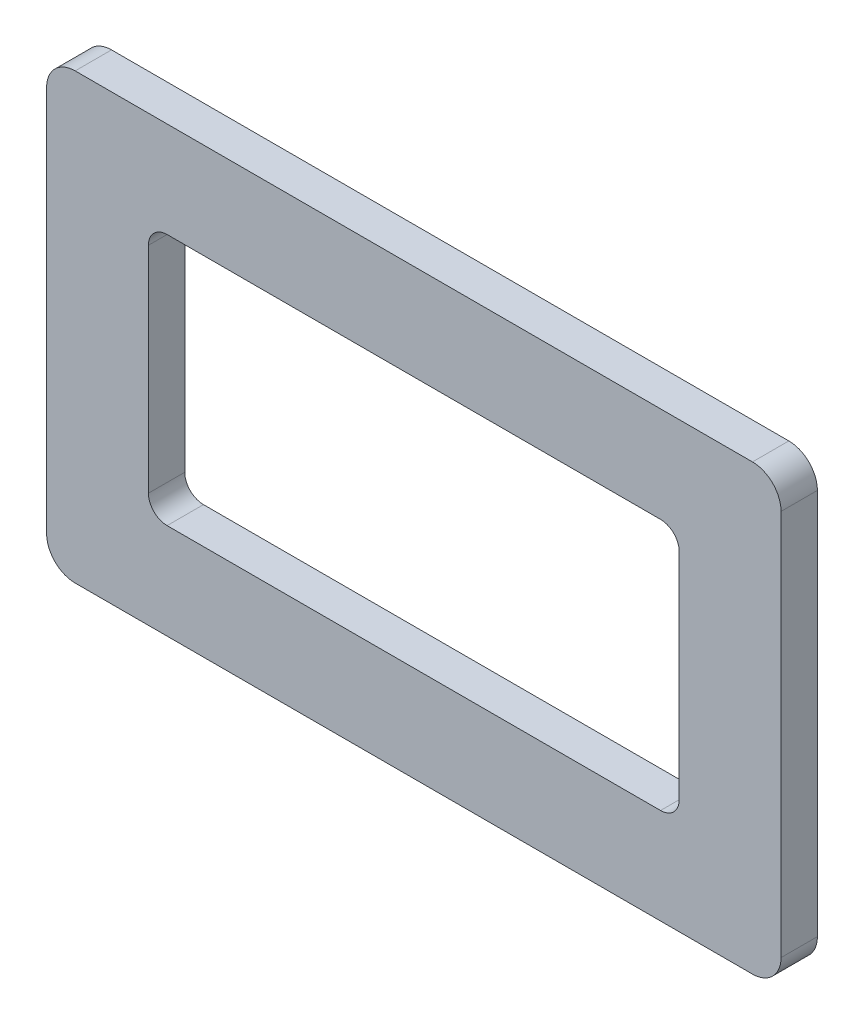
ISO-10303-21;
HEADER;
FILE_DESCRIPTION(('STEP AP214'),'2;1');
FILE_NAME('part.step','',(''),(''),'','','');
FILE_SCHEMA(('AUTOMOTIVE_DESIGN { 1 0 10303 214 1 1 1 1 }'));
ENDSEC;
DATA;
#1=APPLICATION_CONTEXT('core data for automotive mechanical design processes');
#2=APPLICATION_PROTOCOL_DEFINITION('international standard','automotive_design',2000,#1);
#3=PRODUCT_CONTEXT('',#1,'mechanical');
#4=PRODUCT('Part','Part','',(#3));
#5=PRODUCT_RELATED_PRODUCT_CATEGORY('part','',(#4));
#6=PRODUCT_DEFINITION_FORMATION('','',#4);
#7=PRODUCT_DEFINITION_CONTEXT('part definition',#1,'design');
#8=PRODUCT_DEFINITION('design','',#6,#7);
#9=PRODUCT_DEFINITION_SHAPE('','',#8);
#10=(LENGTH_UNIT() NAMED_UNIT(*) SI_UNIT(.MILLI.,.METRE.));
#11=(NAMED_UNIT(*) PLANE_ANGLE_UNIT() SI_UNIT($,.RADIAN.));
#12=(NAMED_UNIT(*) SI_UNIT($,.STERADIAN.) SOLID_ANGLE_UNIT());
#13=UNCERTAINTY_MEASURE_WITH_UNIT(LENGTH_MEASURE(1.E-05),#10,'distance_accuracy_value','');
#14=(GEOMETRIC_REPRESENTATION_CONTEXT(3) GLOBAL_UNCERTAINTY_ASSIGNED_CONTEXT((#13)) GLOBAL_UNIT_ASSIGNED_CONTEXT((#10,
#11,#12)) REPRESENTATION_CONTEXT('',''));
#15=CARTESIAN_POINT('',(0.,0.,0.));
#16=DIRECTION('',(0.,0.,1.));
#17=DIRECTION('',(1.,0.,0.));
#18=AXIS2_PLACEMENT_3D('',#15,#16,#17);
#19=CARTESIAN_POINT('',(0.,0.,3.5));
#20=DIRECTION('',(0.,0.,1.));
#21=DIRECTION('',(1.,0.,0.));
#22=AXIS2_PLACEMENT_3D('',#19,#20,#21);
#23=PLANE('',#22);
#24=DIRECTION('',(0.,-1.,0.));
#25=VECTOR('',#24,1.);
#26=CARTESIAN_POINT('',(-35.35,21.35,3.5));
#27=LINE('',#26,#25);
#28=CARTESIAN_POINT('',(-35.35,18.6,3.5));
#29=VERTEX_POINT('',#28);
#30=CARTESIAN_POINT('',(-35.35,-18.6,3.5));
#31=VERTEX_POINT('',#30);
#32=EDGE_CURVE('E277',#29,#31,#27,.T.);
#33=ORIENTED_EDGE('',*,*,#32,.T.);
#34=CARTESIAN_POINT('',(-32.6,-18.6,3.5));
#35=DIRECTION('',(0.,0.,1.));
#36=DIRECTION('',(1.,0.,0.));
#37=AXIS2_PLACEMENT_3D('',#34,#35,#36);
#38=CIRCLE('',#37,2.75);
#39=CARTESIAN_POINT('',(-32.6,-21.35,3.5));
#40=VERTEX_POINT('',#39);
#41=EDGE_CURVE('E198',#31,#40,#38,.T.);
#42=ORIENTED_EDGE('',*,*,#41,.T.);
#43=DIRECTION('',(1.,0.,0.));
#44=VECTOR('',#43,1.);
#45=CARTESIAN_POINT('',(-35.35,-21.35,3.5));
#46=LINE('',#45,#44);
#47=CARTESIAN_POINT('',(32.6,-21.35,3.5));
#48=VERTEX_POINT('',#47);
#49=EDGE_CURVE('E167',#40,#48,#46,.T.);
#50=ORIENTED_EDGE('',*,*,#49,.T.);
#51=CARTESIAN_POINT('',(32.6,-18.6,3.5));
#52=DIRECTION('',(0.,0.,1.));
#53=DIRECTION('',(1.,0.,0.));
#54=AXIS2_PLACEMENT_3D('',#51,#52,#53);
#55=CIRCLE('',#54,2.75);
#56=CARTESIAN_POINT('',(35.35,-18.6,3.5));
#57=VERTEX_POINT('',#56);
#58=EDGE_CURVE('E196',#48,#57,#55,.T.);
#59=ORIENTED_EDGE('',*,*,#58,.T.);
#60=DIRECTION('',(0.,1.,0.));
#61=VECTOR('',#60,1.);
#62=CARTESIAN_POINT('',(35.35,21.35,3.5));
#63=LINE('',#62,#61);
#64=CARTESIAN_POINT('',(35.35,18.6,3.5));
#65=VERTEX_POINT('',#64);
#66=EDGE_CURVE('E174',#57,#65,#63,.T.);
#67=ORIENTED_EDGE('',*,*,#66,.T.);
#68=CARTESIAN_POINT('',(32.6,18.6,3.5));
#69=DIRECTION('',(0.,0.,1.));
#70=DIRECTION('',(1.,0.,0.));
#71=AXIS2_PLACEMENT_3D('',#68,#69,#70);
#72=CIRCLE('',#71,2.75);
#73=CARTESIAN_POINT('',(32.6,21.35,3.5));
#74=VERTEX_POINT('',#73);
#75=EDGE_CURVE('E194',#65,#74,#72,.T.);
#76=ORIENTED_EDGE('',*,*,#75,.T.);
#77=DIRECTION('',(-1.,0.,0.));
#78=VECTOR('',#77,1.);
#79=CARTESIAN_POINT('',(-35.35,21.35,3.5));
#80=LINE('',#79,#78);
#81=CARTESIAN_POINT('',(-32.6,21.35,3.5));
#82=VERTEX_POINT('',#81);
#83=EDGE_CURVE('E178',#74,#82,#80,.T.);
#84=ORIENTED_EDGE('',*,*,#83,.T.);
#85=CARTESIAN_POINT('',(-32.6,18.6,3.5));
#86=DIRECTION('',(0.,0.,1.));
#87=DIRECTION('',(1.,0.,0.));
#88=AXIS2_PLACEMENT_3D('',#85,#86,#87);
#89=CIRCLE('',#88,2.75);
#90=EDGE_CURVE('E192',#82,#29,#89,.T.);
#91=ORIENTED_EDGE('',*,*,#90,.T.);
#92=EDGE_LOOP('',(#33,#42,#50,#59,#67,#76,#84,#91));
#93=FACE_BOUND('',#92,.T.);
#94=DIRECTION('',(-1.,0.,0.));
#95=VECTOR('',#94,1.);
#96=CARTESIAN_POINT('',(-25.55,12.1343418173395,3.5));
#97=LINE('',#96,#95);
#98=CARTESIAN_POINT('',(23.75,12.1343418173395,3.5));
#99=VERTEX_POINT('',#98);
#100=CARTESIAN_POINT('',(-23.75,12.1343418173395,3.5));
#101=VERTEX_POINT('',#100);
#102=EDGE_CURVE('E256',#99,#101,#97,.T.);
#103=ORIENTED_EDGE('',*,*,#102,.F.);
#104=CARTESIAN_POINT('',(23.75,10.3343418173395,3.5));
#105=DIRECTION('',(0.,0.,1.));
#106=DIRECTION('',(1.,0.,0.));
#107=AXIS2_PLACEMENT_3D('',#104,#105,#106);
#108=CIRCLE('',#107,1.8);
#109=CARTESIAN_POINT('',(25.55,10.3343418173395,3.5));
#110=VERTEX_POINT('',#109);
#111=EDGE_CURVE('E11',#99,#110,#108,.F.);
#112=ORIENTED_EDGE('',*,*,#111,.T.);
#113=DIRECTION('',(0.,1.,0.));
#114=VECTOR('',#113,1.);
#115=CARTESIAN_POINT('',(25.55,12.1343418173395,3.5));
#116=LINE('',#115,#114);
#117=CARTESIAN_POINT('',(25.55,-10.3343418173395,3.5));
#118=VERTEX_POINT('',#117);
#119=EDGE_CURVE('E254',#118,#110,#116,.T.);
#120=ORIENTED_EDGE('',*,*,#119,.F.);
#121=CARTESIAN_POINT('',(23.75,-10.3343418173395,3.5));
#122=DIRECTION('',(0.,0.,1.));
#123=DIRECTION('',(1.,0.,0.));
#124=AXIS2_PLACEMENT_3D('',#121,#122,#123);
#125=CIRCLE('',#124,1.8);
#126=CARTESIAN_POINT('',(23.75,-12.1343418173395,3.5));
#127=VERTEX_POINT('',#126);
#128=EDGE_CURVE('E231',#118,#127,#125,.F.);
#129=ORIENTED_EDGE('',*,*,#128,.T.);
#130=DIRECTION('',(1.,0.,0.));
#131=VECTOR('',#130,1.);
#132=CARTESIAN_POINT('',(-25.55,-12.1343418173395,3.5));
#133=LINE('',#132,#131);
#134=CARTESIAN_POINT('',(-23.75,-12.1343418173395,3.5));
#135=VERTEX_POINT('',#134);
#136=EDGE_CURVE('E268',#135,#127,#133,.T.);
#137=ORIENTED_EDGE('',*,*,#136,.F.);
#138=CARTESIAN_POINT('',(-23.75,-10.3343418173395,3.5));
#139=DIRECTION('',(0.,0.,1.));
#140=DIRECTION('',(1.,0.,0.));
#141=AXIS2_PLACEMENT_3D('',#138,#139,#140);
#142=CIRCLE('',#141,1.8);
#143=CARTESIAN_POINT('',(-25.55,-10.3343418173395,3.5));
#144=VERTEX_POINT('',#143);
#145=EDGE_CURVE('E235',#135,#144,#142,.F.);
#146=ORIENTED_EDGE('',*,*,#145,.T.);
#147=DIRECTION('',(0.,-1.,0.));
#148=VECTOR('',#147,1.);
#149=CARTESIAN_POINT('',(-25.55,12.1343418173395,3.5));
#150=LINE('',#149,#148);
#151=CARTESIAN_POINT('',(-25.55,10.3343418173395,3.5));
#152=VERTEX_POINT('',#151);
#153=EDGE_CURVE('E262',#152,#144,#150,.T.);
#154=ORIENTED_EDGE('',*,*,#153,.F.);
#155=CARTESIAN_POINT('',(-23.75,10.3343418173395,3.5));
#156=DIRECTION('',(0.,0.,1.));
#157=DIRECTION('',(1.,0.,0.));
#158=AXIS2_PLACEMENT_3D('',#155,#156,#157);
#159=CIRCLE('',#158,1.8);
#160=EDGE_CURVE('E48',#152,#101,#159,.F.);
#161=ORIENTED_EDGE('',*,*,#160,.T.);
#162=EDGE_LOOP('',(#103,#112,#120,#129,#137,#146,#154,#161));
#163=FACE_BOUND('',#162,.T.);
#164=ADVANCED_FACE('F33',(#93,#163),#23,.T.);
#165=CARTESIAN_POINT('',(0.,0.,0.));
#166=DIRECTION('',(0.,0.,1.));
#167=DIRECTION('',(1.,0.,0.));
#168=AXIS2_PLACEMENT_3D('',#165,#166,#167);
#169=PLANE('',#168);
#170=DIRECTION('',(1.,0.,0.));
#171=VECTOR('',#170,1.);
#172=CARTESIAN_POINT('',(-35.35,-21.35,0.));
#173=LINE('',#172,#171);
#174=CARTESIAN_POINT('',(-32.6,-21.35,0.));
#175=VERTEX_POINT('',#174);
#176=CARTESIAN_POINT('',(32.6,-21.35,0.));
#177=VERTEX_POINT('',#176);
#178=EDGE_CURVE('E164',#175,#177,#173,.T.);
#179=ORIENTED_EDGE('',*,*,#178,.F.);
#180=CARTESIAN_POINT('',(-32.6,-18.6,0.));
#181=DIRECTION('',(0.,0.,1.));
#182=DIRECTION('',(1.,0.,0.));
#183=AXIS2_PLACEMENT_3D('',#180,#181,#182);
#184=CIRCLE('',#183,2.75);
#185=CARTESIAN_POINT('',(-35.35,-18.6,0.));
#186=VERTEX_POINT('',#185);
#187=EDGE_CURVE('E147',#175,#186,#184,.F.);
#188=ORIENTED_EDGE('',*,*,#187,.T.);
#189=DIRECTION('',(0.,-1.,0.));
#190=VECTOR('',#189,1.);
#191=CARTESIAN_POINT('',(-35.35,21.35,0.));
#192=LINE('',#191,#190);
#193=CARTESIAN_POINT('',(-35.35,18.6,0.));
#194=VERTEX_POINT('',#193);
#195=EDGE_CURVE('E175',#194,#186,#192,.T.);
#196=ORIENTED_EDGE('',*,*,#195,.F.);
#197=CARTESIAN_POINT('',(-32.6,18.6,0.));
#198=DIRECTION('',(0.,0.,1.));
#199=DIRECTION('',(1.,0.,0.));
#200=AXIS2_PLACEMENT_3D('',#197,#198,#199);
#201=CIRCLE('',#200,2.75);
#202=CARTESIAN_POINT('',(-32.6,21.35,0.));
#203=VERTEX_POINT('',#202);
#204=EDGE_CURVE('E168',#194,#203,#201,.F.);
#205=ORIENTED_EDGE('',*,*,#204,.T.);
#206=DIRECTION('',(-1.,0.,0.));
#207=VECTOR('',#206,1.);
#208=CARTESIAN_POINT('',(-35.35,21.35,0.));
#209=LINE('',#208,#207);
#210=CARTESIAN_POINT('',(32.6,21.35,0.));
#211=VERTEX_POINT('',#210);
#212=EDGE_CURVE('E180',#211,#203,#209,.T.);
#213=ORIENTED_EDGE('',*,*,#212,.F.);
#214=CARTESIAN_POINT('',(32.6,18.6,0.));
#215=DIRECTION('',(0.,0.,1.));
#216=DIRECTION('',(1.,0.,0.));
#217=AXIS2_PLACEMENT_3D('',#214,#215,#216);
#218=CIRCLE('',#217,2.75);
#219=CARTESIAN_POINT('',(35.35,18.6,0.));
#220=VERTEX_POINT('',#219);
#221=EDGE_CURVE('E186',#211,#220,#218,.F.);
#222=ORIENTED_EDGE('',*,*,#221,.T.);
#223=DIRECTION('',(0.,1.,0.));
#224=VECTOR('',#223,1.);
#225=CARTESIAN_POINT('',(35.35,21.35,0.));
#226=LINE('',#225,#224);
#227=CARTESIAN_POINT('',(35.35,-18.6,0.));
#228=VERTEX_POINT('',#227);
#229=EDGE_CURVE('E271',#228,#220,#226,.T.);
#230=ORIENTED_EDGE('',*,*,#229,.F.);
#231=CARTESIAN_POINT('',(32.6,-18.6,0.));
#232=DIRECTION('',(0.,0.,1.));
#233=DIRECTION('',(1.,0.,0.));
#234=AXIS2_PLACEMENT_3D('',#231,#232,#233);
#235=CIRCLE('',#234,2.75);
#236=EDGE_CURVE('E158',#228,#177,#235,.F.);
#237=ORIENTED_EDGE('',*,*,#236,.T.);
#238=EDGE_LOOP('',(#179,#188,#196,#205,#213,#222,#230,#237));
#239=FACE_BOUND('',#238,.T.);
#240=DIRECTION('',(1.,0.,0.));
#241=VECTOR('',#240,1.);
#242=CARTESIAN_POINT('',(-25.55,-12.1343418173395,0.));
#243=LINE('',#242,#241);
#244=CARTESIAN_POINT('',(-23.75,-12.1343418173395,0.));
#245=VERTEX_POINT('',#244);
#246=CARTESIAN_POINT('',(23.75,-12.1343418173395,0.));
#247=VERTEX_POINT('',#246);
#248=EDGE_CURVE('E260',#245,#247,#243,.T.);
#249=ORIENTED_EDGE('',*,*,#248,.T.);
#250=CARTESIAN_POINT('',(23.75,-10.3343418173395,0.));
#251=DIRECTION('',(0.,0.,1.));
#252=DIRECTION('',(1.,0.,0.));
#253=AXIS2_PLACEMENT_3D('',#250,#251,#252);
#254=CIRCLE('',#253,1.8);
#255=CARTESIAN_POINT('',(25.55,-10.3343418173395,0.));
#256=VERTEX_POINT('',#255);
#257=EDGE_CURVE('E229',#247,#256,#254,.T.);
#258=ORIENTED_EDGE('',*,*,#257,.T.);
#259=DIRECTION('',(0.,1.,0.));
#260=VECTOR('',#259,1.);
#261=CARTESIAN_POINT('',(25.55,12.1343418173395,0.));
#262=LINE('',#261,#260);
#263=CARTESIAN_POINT('',(25.55,10.3343418173395,0.));
#264=VERTEX_POINT('',#263);
#265=EDGE_CURVE('E244',#256,#264,#262,.T.);
#266=ORIENTED_EDGE('',*,*,#265,.T.);
#267=CARTESIAN_POINT('',(23.75,10.3343418173395,0.));
#268=DIRECTION('',(0.,0.,1.));
#269=DIRECTION('',(1.,0.,0.));
#270=AXIS2_PLACEMENT_3D('',#267,#268,#269);
#271=CIRCLE('',#270,1.8);
#272=CARTESIAN_POINT('',(23.75,12.1343418173395,0.));
#273=VERTEX_POINT('',#272);
#274=EDGE_CURVE('E41',#264,#273,#271,.T.);
#275=ORIENTED_EDGE('',*,*,#274,.T.);
#276=DIRECTION('',(-1.,0.,0.));
#277=VECTOR('',#276,1.);
#278=CARTESIAN_POINT('',(-25.55,12.1343418173395,0.));
#279=LINE('',#278,#277);
#280=CARTESIAN_POINT('',(-23.75,12.1343418173395,0.));
#281=VERTEX_POINT('',#280);
#282=EDGE_CURVE('E242',#273,#281,#279,.T.);
#283=ORIENTED_EDGE('',*,*,#282,.T.);
#284=CARTESIAN_POINT('',(-23.75,10.3343418173395,0.));
#285=DIRECTION('',(0.,0.,1.));
#286=DIRECTION('',(1.,0.,0.));
#287=AXIS2_PLACEMENT_3D('',#284,#285,#286);
#288=CIRCLE('',#287,1.8);
#289=CARTESIAN_POINT('',(-25.55,10.3343418173395,0.));
#290=VERTEX_POINT('',#289);
#291=EDGE_CURVE('E237',#281,#290,#288,.T.);
#292=ORIENTED_EDGE('',*,*,#291,.T.);
#293=DIRECTION('',(0.,-1.,0.));
#294=VECTOR('',#293,1.);
#295=CARTESIAN_POINT('',(-25.55,12.1343418173395,0.));
#296=LINE('',#295,#294);
#297=CARTESIAN_POINT('',(-25.55,-10.3343418173395,0.));
#298=VERTEX_POINT('',#297);
#299=EDGE_CURVE('E249',#290,#298,#296,.T.);
#300=ORIENTED_EDGE('',*,*,#299,.T.);
#301=CARTESIAN_POINT('',(-23.75,-10.3343418173395,0.));
#302=DIRECTION('',(0.,0.,1.));
#303=DIRECTION('',(1.,0.,0.));
#304=AXIS2_PLACEMENT_3D('',#301,#302,#303);
#305=CIRCLE('',#304,1.8);
#306=EDGE_CURVE('E233',#298,#245,#305,.T.);
#307=ORIENTED_EDGE('',*,*,#306,.T.);
#308=EDGE_LOOP('',(#249,#258,#266,#275,#283,#292,#300,#307));
#309=FACE_BOUND('',#308,.T.);
#310=ADVANCED_FACE('F171',(#239,#309),#169,.F.);
#311=CARTESIAN_POINT('',(35.35,21.35,3.5));
#312=DIRECTION('',(-1.,0.,0.));
#313=DIRECTION('',(0.,0.,1.));
#314=AXIS2_PLACEMENT_3D('',#311,#312,#313);
#315=PLANE('',#314);
#316=ORIENTED_EDGE('',*,*,#66,.F.);
#317=DIRECTION('',(0.,0.,-1.));
#318=VECTOR('',#317,1.);
#319=CARTESIAN_POINT('',(35.35,-18.6,3.5));
#320=LINE('',#319,#318);
#321=EDGE_CURVE('E202',#57,#228,#320,.T.);
#322=ORIENTED_EDGE('',*,*,#321,.T.);
#323=ORIENTED_EDGE('',*,*,#229,.T.);
#324=DIRECTION('',(0.,0.,-1.));
#325=VECTOR('',#324,1.);
#326=CARTESIAN_POINT('',(35.35,18.6,3.5));
#327=LINE('',#326,#325);
#328=EDGE_CURVE('E200',#220,#65,#327,.F.);
#329=ORIENTED_EDGE('',*,*,#328,.T.);
#330=EDGE_LOOP('',(#316,#322,#323,#329));
#331=FACE_BOUND('',#330,.T.);
#332=ADVANCED_FACE('F304',(#331),#315,.F.);
#333=CARTESIAN_POINT('',(-35.35,21.35,3.5));
#334=DIRECTION('',(0.,-1.,0.));
#335=DIRECTION('',(0.,0.,-1.));
#336=AXIS2_PLACEMENT_3D('',#333,#334,#335);
#337=PLANE('',#336);
#338=ORIENTED_EDGE('',*,*,#83,.F.);
#339=DIRECTION('',(0.,0.,-1.));
#340=VECTOR('',#339,1.);
#341=CARTESIAN_POINT('',(32.6,21.35,3.5));
#342=LINE('',#341,#340);
#343=EDGE_CURVE('E207',#74,#211,#342,.T.);
#344=ORIENTED_EDGE('',*,*,#343,.T.);
#345=ORIENTED_EDGE('',*,*,#212,.T.);
#346=DIRECTION('',(0.,0.,-1.));
#347=VECTOR('',#346,1.);
#348=CARTESIAN_POINT('',(-32.6,21.35,3.5));
#349=LINE('',#348,#347);
#350=EDGE_CURVE('E205',#203,#82,#349,.F.);
#351=ORIENTED_EDGE('',*,*,#350,.T.);
#352=EDGE_LOOP('',(#338,#344,#345,#351));
#353=FACE_BOUND('',#352,.T.);
#354=ADVANCED_FACE('F287',(#353),#337,.F.);
#355=CARTESIAN_POINT('',(-35.35,21.35,3.5));
#356=DIRECTION('',(1.,0.,0.));
#357=DIRECTION('',(0.,1.,0.));
#358=AXIS2_PLACEMENT_3D('',#355,#356,#357);
#359=PLANE('',#358);
#360=ORIENTED_EDGE('',*,*,#195,.T.);
#361=DIRECTION('',(0.,0.,-1.));
#362=VECTOR('',#361,1.);
#363=CARTESIAN_POINT('',(-35.35,-18.6,3.5));
#364=LINE('',#363,#362);
#365=EDGE_CURVE('E152',#186,#31,#364,.F.);
#366=ORIENTED_EDGE('',*,*,#365,.T.);
#367=ORIENTED_EDGE('',*,*,#32,.F.);
#368=DIRECTION('',(0.,0.,-1.));
#369=VECTOR('',#368,1.);
#370=CARTESIAN_POINT('',(-35.35,18.6,3.5));
#371=LINE('',#370,#369);
#372=EDGE_CURVE('E157',#29,#194,#371,.T.);
#373=ORIENTED_EDGE('',*,*,#372,.T.);
#374=EDGE_LOOP('',(#360,#366,#367,#373));
#375=FACE_BOUND('',#374,.T.);
#376=ADVANCED_FACE('F296',(#375),#359,.F.);
#377=CARTESIAN_POINT('',(-35.35,-21.35,3.5));
#378=DIRECTION('',(0.,1.,0.));
#379=DIRECTION('',(0.,0.,1.));
#380=AXIS2_PLACEMENT_3D('',#377,#378,#379);
#381=PLANE('',#380);
#382=ORIENTED_EDGE('',*,*,#49,.F.);
#383=DIRECTION('',(0.,0.,-1.));
#384=VECTOR('',#383,1.);
#385=CARTESIAN_POINT('',(-32.6,-21.35,3.5));
#386=LINE('',#385,#384);
#387=EDGE_CURVE('E151',#40,#175,#386,.T.);
#388=ORIENTED_EDGE('',*,*,#387,.T.);
#389=ORIENTED_EDGE('',*,*,#178,.T.);
#390=DIRECTION('',(0.,0.,-1.));
#391=VECTOR('',#390,1.);
#392=CARTESIAN_POINT('',(32.6,-21.35,3.5));
#393=LINE('',#392,#391);
#394=EDGE_CURVE('E169',#177,#48,#393,.F.);
#395=ORIENTED_EDGE('',*,*,#394,.T.);
#396=EDGE_LOOP('',(#382,#388,#389,#395));
#397=FACE_BOUND('',#396,.T.);
#398=ADVANCED_FACE('F163',(#397),#381,.F.);
#399=CARTESIAN_POINT('',(25.55,12.1343418173395,3.5));
#400=DIRECTION('',(-1.,0.,0.));
#401=DIRECTION('',(0.,0.,1.));
#402=AXIS2_PLACEMENT_3D('',#399,#400,#401);
#403=PLANE('',#402);
#404=ORIENTED_EDGE('',*,*,#265,.F.);
#405=DIRECTION('',(0.,0.,-1.));
#406=VECTOR('',#405,1.);
#407=CARTESIAN_POINT('',(25.55,-10.3343418173395,3.5));
#408=LINE('',#407,#406);
#409=EDGE_CURVE('E218',#256,#118,#408,.F.);
#410=ORIENTED_EDGE('',*,*,#409,.T.);
#411=ORIENTED_EDGE('',*,*,#119,.T.);
#412=DIRECTION('',(0.,0.,-1.));
#413=VECTOR('',#412,1.);
#414=CARTESIAN_POINT('',(25.55,10.3343418173395,0.));
#415=LINE('',#414,#413);
#416=EDGE_CURVE('E215',#110,#264,#415,.T.);
#417=ORIENTED_EDGE('',*,*,#416,.T.);
#418=EDGE_LOOP('',(#404,#410,#411,#417));
#419=FACE_BOUND('',#418,.T.);
#420=ADVANCED_FACE('F258',(#419),#403,.T.);
#421=CARTESIAN_POINT('',(-25.55,12.1343418173395,3.5));
#422=DIRECTION('',(0.,-1.,0.));
#423=DIRECTION('',(0.,0.,-1.));
#424=AXIS2_PLACEMENT_3D('',#421,#422,#423);
#425=PLANE('',#424);
#426=ORIENTED_EDGE('',*,*,#102,.T.);
#427=DIRECTION('',(0.,0.,-1.));
#428=VECTOR('',#427,1.);
#429=CARTESIAN_POINT('',(-23.75,12.1343418173395,0.));
#430=LINE('',#429,#428);
#431=EDGE_CURVE('E226',#101,#281,#430,.T.);
#432=ORIENTED_EDGE('',*,*,#431,.T.);
#433=ORIENTED_EDGE('',*,*,#282,.F.);
#434=DIRECTION('',(0.,0.,-1.));
#435=VECTOR('',#434,1.);
#436=CARTESIAN_POINT('',(23.75,12.1343418173395,3.5));
#437=LINE('',#436,#435);
#438=EDGE_CURVE('E55',#273,#99,#437,.F.);
#439=ORIENTED_EDGE('',*,*,#438,.T.);
#440=EDGE_LOOP('',(#426,#432,#433,#439));
#441=FACE_BOUND('',#440,.T.);
#442=ADVANCED_FACE('F247',(#441),#425,.T.);
#443=CARTESIAN_POINT('',(-25.55,12.1343418173395,3.5));
#444=DIRECTION('',(1.,0.,0.));
#445=DIRECTION('',(0.,0.,-1.));
#446=AXIS2_PLACEMENT_3D('',#443,#444,#445);
#447=PLANE('',#446);
#448=ORIENTED_EDGE('',*,*,#153,.T.);
#449=DIRECTION('',(0.,0.,-1.));
#450=VECTOR('',#449,1.);
#451=CARTESIAN_POINT('',(-25.55,-10.3343418173395,0.));
#452=LINE('',#451,#450);
#453=EDGE_CURVE('E222',#144,#298,#452,.T.);
#454=ORIENTED_EDGE('',*,*,#453,.T.);
#455=ORIENTED_EDGE('',*,*,#299,.F.);
#456=DIRECTION('',(0.,0.,-1.));
#457=VECTOR('',#456,1.);
#458=CARTESIAN_POINT('',(-25.55,10.3343418173395,3.5));
#459=LINE('',#458,#457);
#460=EDGE_CURVE('E220',#290,#152,#459,.F.);
#461=ORIENTED_EDGE('',*,*,#460,.T.);
#462=EDGE_LOOP('',(#448,#454,#455,#461));
#463=FACE_BOUND('',#462,.T.);
#464=ADVANCED_FACE('F317',(#463),#447,.T.);
#465=CARTESIAN_POINT('',(-25.55,-12.1343418173395,3.5));
#466=DIRECTION('',(0.,1.,0.));
#467=DIRECTION('',(0.,0.,1.));
#468=AXIS2_PLACEMENT_3D('',#465,#466,#467);
#469=PLANE('',#468);
#470=ORIENTED_EDGE('',*,*,#136,.T.);
#471=DIRECTION('',(0.,0.,-1.));
#472=VECTOR('',#471,1.);
#473=CARTESIAN_POINT('',(23.75,-12.1343418173395,0.));
#474=LINE('',#473,#472);
#475=EDGE_CURVE('E212',#127,#247,#474,.T.);
#476=ORIENTED_EDGE('',*,*,#475,.T.);
#477=ORIENTED_EDGE('',*,*,#248,.F.);
#478=DIRECTION('',(0.,0.,-1.));
#479=VECTOR('',#478,1.);
#480=CARTESIAN_POINT('',(-23.75,-12.1343418173395,3.5));
#481=LINE('',#480,#479);
#482=EDGE_CURVE('E210',#245,#135,#481,.F.);
#483=ORIENTED_EDGE('',*,*,#482,.T.);
#484=EDGE_LOOP('',(#470,#476,#477,#483));
#485=FACE_BOUND('',#484,.T.);
#486=ADVANCED_FACE('F320',(#485),#469,.T.);
#487=CARTESIAN_POINT('',(-32.6,-18.6,3.5));
#488=DIRECTION('',(0.,0.,-1.));
#489=DIRECTION('',(-1.,0.,0.));
#490=AXIS2_PLACEMENT_3D('',#487,#488,#489);
#491=CYLINDRICAL_SURFACE('',#490,2.75);
#492=ORIENTED_EDGE('',*,*,#41,.F.);
#493=ORIENTED_EDGE('',*,*,#365,.F.);
#494=ORIENTED_EDGE('',*,*,#187,.F.);
#495=ORIENTED_EDGE('',*,*,#387,.F.);
#496=EDGE_LOOP('',(#492,#493,#494,#495));
#497=FACE_BOUND('',#496,.T.);
#498=ADVANCED_FACE('F150',(#497),#491,.T.);
#499=CARTESIAN_POINT('',(32.6,-18.6,3.5));
#500=DIRECTION('',(0.,0.,-1.));
#501=DIRECTION('',(-1.,0.,0.));
#502=AXIS2_PLACEMENT_3D('',#499,#500,#501);
#503=CYLINDRICAL_SURFACE('',#502,2.75);
#504=ORIENTED_EDGE('',*,*,#58,.F.);
#505=ORIENTED_EDGE('',*,*,#394,.F.);
#506=ORIENTED_EDGE('',*,*,#236,.F.);
#507=ORIENTED_EDGE('',*,*,#321,.F.);
#508=EDGE_LOOP('',(#504,#505,#506,#507));
#509=FACE_BOUND('',#508,.T.);
#510=ADVANCED_FACE('F327',(#509),#503,.T.);
#511=CARTESIAN_POINT('',(32.6,18.6,3.5));
#512=DIRECTION('',(0.,0.,-1.));
#513=DIRECTION('',(-1.,0.,0.));
#514=AXIS2_PLACEMENT_3D('',#511,#512,#513);
#515=CYLINDRICAL_SURFACE('',#514,2.75);
#516=ORIENTED_EDGE('',*,*,#75,.F.);
#517=ORIENTED_EDGE('',*,*,#328,.F.);
#518=ORIENTED_EDGE('',*,*,#221,.F.);
#519=ORIENTED_EDGE('',*,*,#343,.F.);
#520=EDGE_LOOP('',(#516,#517,#518,#519));
#521=FACE_BOUND('',#520,.T.);
#522=ADVANCED_FACE('F354',(#521),#515,.T.);
#523=CARTESIAN_POINT('',(-32.6,18.6,3.5));
#524=DIRECTION('',(0.,0.,-1.));
#525=DIRECTION('',(-1.,0.,0.));
#526=AXIS2_PLACEMENT_3D('',#523,#524,#525);
#527=CYLINDRICAL_SURFACE('',#526,2.75);
#528=ORIENTED_EDGE('',*,*,#90,.F.);
#529=ORIENTED_EDGE('',*,*,#350,.F.);
#530=ORIENTED_EDGE('',*,*,#204,.F.);
#531=ORIENTED_EDGE('',*,*,#372,.F.);
#532=EDGE_LOOP('',(#528,#529,#530,#531));
#533=FACE_BOUND('',#532,.T.);
#534=ADVANCED_FACE('F291',(#533),#527,.T.);
#535=CARTESIAN_POINT('',(23.75,-10.3343418173395,3.5));
#536=DIRECTION('',(0.,0.,1.));
#537=DIRECTION('',(1.,0.,0.));
#538=AXIS2_PLACEMENT_3D('',#535,#536,#537);
#539=CYLINDRICAL_SURFACE('',#538,1.8);
#540=ORIENTED_EDGE('',*,*,#128,.F.);
#541=ORIENTED_EDGE('',*,*,#409,.F.);
#542=ORIENTED_EDGE('',*,*,#257,.F.);
#543=ORIENTED_EDGE('',*,*,#475,.F.);
#544=EDGE_LOOP('',(#540,#541,#542,#543));
#545=FACE_BOUND('',#544,.T.);
#546=ADVANCED_FACE('F335',(#545),#539,.F.);
#547=CARTESIAN_POINT('',(-23.75,-10.3343418173395,3.5));
#548=DIRECTION('',(0.,0.,1.));
#549=DIRECTION('',(1.,0.,0.));
#550=AXIS2_PLACEMENT_3D('',#547,#548,#549);
#551=CYLINDRICAL_SURFACE('',#550,1.8);
#552=ORIENTED_EDGE('',*,*,#145,.F.);
#553=ORIENTED_EDGE('',*,*,#482,.F.);
#554=ORIENTED_EDGE('',*,*,#306,.F.);
#555=ORIENTED_EDGE('',*,*,#453,.F.);
#556=EDGE_LOOP('',(#552,#553,#554,#555));
#557=FACE_BOUND('',#556,.T.);
#558=ADVANCED_FACE('F337',(#557),#551,.F.);
#559=CARTESIAN_POINT('',(-23.75,10.3343418173395,3.5));
#560=DIRECTION('',(0.,0.,1.));
#561=DIRECTION('',(1.,0.,0.));
#562=AXIS2_PLACEMENT_3D('',#559,#560,#561);
#563=CYLINDRICAL_SURFACE('',#562,1.8);
#564=ORIENTED_EDGE('',*,*,#160,.F.);
#565=ORIENTED_EDGE('',*,*,#460,.F.);
#566=ORIENTED_EDGE('',*,*,#291,.F.);
#567=ORIENTED_EDGE('',*,*,#431,.F.);
#568=EDGE_LOOP('',(#564,#565,#566,#567));
#569=FACE_BOUND('',#568,.T.);
#570=ADVANCED_FACE('F342',(#569),#563,.F.);
#571=CARTESIAN_POINT('',(23.75,10.3343418173395,3.5));
#572=DIRECTION('',(0.,0.,1.));
#573=DIRECTION('',(1.,0.,0.));
#574=AXIS2_PLACEMENT_3D('',#571,#572,#573);
#575=CYLINDRICAL_SURFACE('',#574,1.8);
#576=ORIENTED_EDGE('',*,*,#111,.F.);
#577=ORIENTED_EDGE('',*,*,#438,.F.);
#578=ORIENTED_EDGE('',*,*,#274,.F.);
#579=ORIENTED_EDGE('',*,*,#416,.F.);
#580=EDGE_LOOP('',(#576,#577,#578,#579));
#581=FACE_BOUND('',#580,.T.);
#582=ADVANCED_FACE('F35',(#581),#575,.F.);
#583=CLOSED_SHELL('',(#164,#310,#332,#354,#376,#398,#420,#442,#464,#486,#498,#510,#522,#534,
#546,#558,#570,#582));
#584=MANIFOLD_SOLID_BREP('B2',#583);
#585=ADVANCED_BREP_SHAPE_REPRESENTATION('',(#18,#584),#14);
#586=SHAPE_DEFINITION_REPRESENTATION(#9,#585);
ENDSEC;
END-ISO-10303-21;
